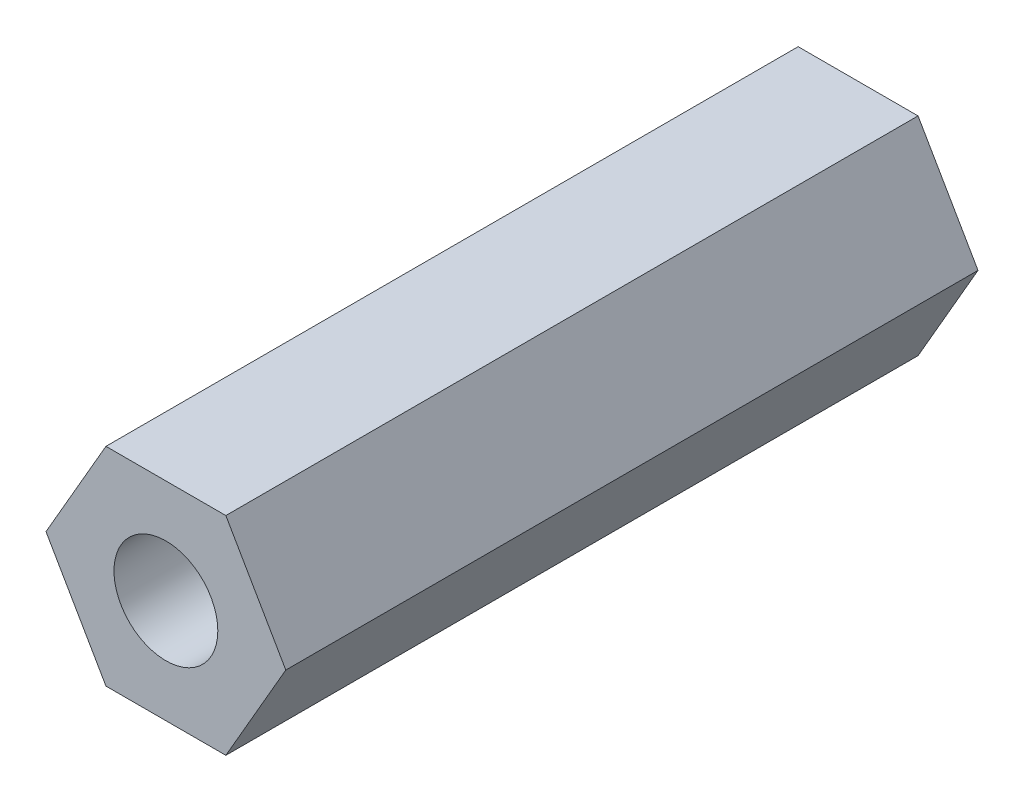
ISO-10303-21;
HEADER;
FILE_DESCRIPTION(('STEP AP214'),'2;1');
FILE_NAME('part.step','',(''),(''),'','','');
FILE_SCHEMA(('AUTOMOTIVE_DESIGN { 1 0 10303 214 1 1 1 1 }'));
ENDSEC;
DATA;
#1=APPLICATION_CONTEXT('core data for automotive mechanical design processes');
#2=APPLICATION_PROTOCOL_DEFINITION('international standard','automotive_design',2000,#1);
#3=PRODUCT_CONTEXT('',#1,'mechanical');
#4=PRODUCT('Part','Part','',(#3));
#5=PRODUCT_RELATED_PRODUCT_CATEGORY('part','',(#4));
#6=PRODUCT_DEFINITION_FORMATION('','',#4);
#7=PRODUCT_DEFINITION_CONTEXT('part definition',#1,'design');
#8=PRODUCT_DEFINITION('design','',#6,#7);
#9=PRODUCT_DEFINITION_SHAPE('','',#8);
#10=(LENGTH_UNIT() NAMED_UNIT(*) SI_UNIT(.MILLI.,.METRE.));
#11=(NAMED_UNIT(*) PLANE_ANGLE_UNIT() SI_UNIT($,.RADIAN.));
#12=(NAMED_UNIT(*) SI_UNIT($,.STERADIAN.) SOLID_ANGLE_UNIT());
#13=UNCERTAINTY_MEASURE_WITH_UNIT(LENGTH_MEASURE(1.E-05),#10,'distance_accuracy_value','');
#14=(GEOMETRIC_REPRESENTATION_CONTEXT(3) GLOBAL_UNCERTAINTY_ASSIGNED_CONTEXT((#13)) GLOBAL_UNIT_ASSIGNED_CONTEXT((#10,
#11,#12)) REPRESENTATION_CONTEXT('',''));
#15=CARTESIAN_POINT('',(0.,0.,0.));
#16=DIRECTION('',(0.,0.,1.));
#17=DIRECTION('',(1.,0.,0.));
#18=AXIS2_PLACEMENT_3D('',#15,#16,#17);
#19=CARTESIAN_POINT('',(0.,-3.,20.));
#20=DIRECTION('',(0.,1.,0.));
#21=DIRECTION('',(0.,0.,1.));
#22=AXIS2_PLACEMENT_3D('',#19,#20,#21);
#23=PLANE('',#22);
#24=DIRECTION('',(1.,0.,0.));
#25=VECTOR('',#24,1.);
#26=CARTESIAN_POINT('',(0.,-3.,0.));
#27=LINE('',#26,#25);
#28=CARTESIAN_POINT('',(-1.73205080756888,-3.,0.));
#29=VERTEX_POINT('',#28);
#30=CARTESIAN_POINT('',(1.73205080756888,-3.,0.));
#31=VERTEX_POINT('',#30);
#32=EDGE_CURVE('E129',#29,#31,#27,.T.);
#33=ORIENTED_EDGE('',*,*,#32,.T.);
#34=DIRECTION('',(0.,0.,-1.));
#35=VECTOR('',#34,1.);
#36=CARTESIAN_POINT('',(1.73205080756888,-3.,20.));
#37=LINE('',#36,#35);
#38=CARTESIAN_POINT('',(1.73205080756888,-3.,20.));
#39=VERTEX_POINT('',#38);
#40=EDGE_CURVE('E11',#39,#31,#37,.T.);
#41=ORIENTED_EDGE('',*,*,#40,.F.);
#42=DIRECTION('',(1.,0.,0.));
#43=VECTOR('',#42,1.);
#44=CARTESIAN_POINT('',(0.,-3.,20.));
#45=LINE('',#44,#43);
#46=CARTESIAN_POINT('',(-1.73205080756888,-3.,20.));
#47=VERTEX_POINT('',#46);
#48=EDGE_CURVE('E152',#47,#39,#45,.T.);
#49=ORIENTED_EDGE('',*,*,#48,.F.);
#50=DIRECTION('',(0.,0.,-1.));
#51=VECTOR('',#50,1.);
#52=CARTESIAN_POINT('',(-1.73205080756888,-3.,20.));
#53=LINE('',#52,#51);
#54=EDGE_CURVE('E122',#47,#29,#53,.T.);
#55=ORIENTED_EDGE('',*,*,#54,.T.);
#56=EDGE_LOOP('',(#33,#41,#49,#55));
#57=FACE_BOUND('',#56,.T.);
#58=ADVANCED_FACE('F41',(#57),#23,.F.);
#59=CARTESIAN_POINT('',(2.59807621135332,-1.5,20.));
#60=DIRECTION('',(-0.866025403784439,0.5,0.));
#61=DIRECTION('',(-0.5,-0.866025403784439,0.));
#62=AXIS2_PLACEMENT_3D('',#59,#60,#61);
#63=PLANE('',#62);
#64=DIRECTION('',(0.5,0.866025403784439,0.));
#65=VECTOR('',#64,1.);
#66=CARTESIAN_POINT('',(2.59807621135332,-1.5,0.));
#67=LINE('',#66,#65);
#68=CARTESIAN_POINT('',(3.46410161513776,0.,0.));
#69=VERTEX_POINT('',#68);
#70=EDGE_CURVE('E132',#31,#69,#67,.T.);
#71=ORIENTED_EDGE('',*,*,#70,.T.);
#72=DIRECTION('',(0.,0.,-1.));
#73=VECTOR('',#72,1.);
#74=CARTESIAN_POINT('',(3.46410161513776,0.,20.));
#75=LINE('',#74,#73);
#76=CARTESIAN_POINT('',(3.46410161513776,0.,20.));
#77=VERTEX_POINT('',#76);
#78=EDGE_CURVE('E50',#77,#69,#75,.T.);
#79=ORIENTED_EDGE('',*,*,#78,.F.);
#80=DIRECTION('',(0.5,0.866025403784439,0.));
#81=VECTOR('',#80,1.);
#82=CARTESIAN_POINT('',(2.59807621135332,-1.5,20.));
#83=LINE('',#82,#81);
#84=EDGE_CURVE('E95',#39,#77,#83,.T.);
#85=ORIENTED_EDGE('',*,*,#84,.F.);
#86=ORIENTED_EDGE('',*,*,#40,.T.);
#87=EDGE_LOOP('',(#71,#79,#85,#86));
#88=FACE_BOUND('',#87,.T.);
#89=ADVANCED_FACE('F166',(#88),#63,.F.);
#90=CARTESIAN_POINT('',(2.59807621135332,1.5,20.));
#91=DIRECTION('',(-0.866025403784439,-0.5,0.));
#92=DIRECTION('',(0.5,-0.866025403784439,0.));
#93=AXIS2_PLACEMENT_3D('',#90,#91,#92);
#94=PLANE('',#93);
#95=DIRECTION('',(-0.5,0.866025403784439,0.));
#96=VECTOR('',#95,1.);
#97=CARTESIAN_POINT('',(2.59807621135332,1.5,0.));
#98=LINE('',#97,#96);
#99=CARTESIAN_POINT('',(1.73205080756888,3.,0.));
#100=VERTEX_POINT('',#99);
#101=EDGE_CURVE('E134',#69,#100,#98,.T.);
#102=ORIENTED_EDGE('',*,*,#101,.T.);
#103=DIRECTION('',(0.,0.,-1.));
#104=VECTOR('',#103,1.);
#105=CARTESIAN_POINT('',(1.73205080756888,3.,20.));
#106=LINE('',#105,#104);
#107=CARTESIAN_POINT('',(1.73205080756888,3.,20.));
#108=VERTEX_POINT('',#107);
#109=EDGE_CURVE('E117',#108,#100,#106,.T.);
#110=ORIENTED_EDGE('',*,*,#109,.F.);
#111=DIRECTION('',(-0.5,0.866025403784439,0.));
#112=VECTOR('',#111,1.);
#113=CARTESIAN_POINT('',(2.59807621135332,1.5,20.));
#114=LINE('',#113,#112);
#115=EDGE_CURVE('E108',#77,#108,#114,.T.);
#116=ORIENTED_EDGE('',*,*,#115,.F.);
#117=ORIENTED_EDGE('',*,*,#78,.T.);
#118=EDGE_LOOP('',(#102,#110,#116,#117));
#119=FACE_BOUND('',#118,.T.);
#120=ADVANCED_FACE('F145',(#119),#94,.F.);
#121=CARTESIAN_POINT('',(0.,3.,20.));
#122=DIRECTION('',(0.,-1.,0.));
#123=DIRECTION('',(1.,0.,0.));
#124=AXIS2_PLACEMENT_3D('',#121,#122,#123);
#125=PLANE('',#124);
#126=DIRECTION('',(-1.,0.,0.));
#127=VECTOR('',#126,1.);
#128=CARTESIAN_POINT('',(0.,3.,0.));
#129=LINE('',#128,#127);
#130=CARTESIAN_POINT('',(-1.73205080756888,3.,0.));
#131=VERTEX_POINT('',#130);
#132=EDGE_CURVE('E116',#100,#131,#129,.T.);
#133=ORIENTED_EDGE('',*,*,#132,.T.);
#134=DIRECTION('',(0.,0.,-1.));
#135=VECTOR('',#134,1.);
#136=CARTESIAN_POINT('',(-1.73205080756888,3.,20.));
#137=LINE('',#136,#135);
#138=CARTESIAN_POINT('',(-1.73205080756888,3.,20.));
#139=VERTEX_POINT('',#138);
#140=EDGE_CURVE('E113',#139,#131,#137,.T.);
#141=ORIENTED_EDGE('',*,*,#140,.F.);
#142=DIRECTION('',(-1.,0.,0.));
#143=VECTOR('',#142,1.);
#144=CARTESIAN_POINT('',(0.,3.,20.));
#145=LINE('',#144,#143);
#146=EDGE_CURVE('E102',#108,#139,#145,.T.);
#147=ORIENTED_EDGE('',*,*,#146,.F.);
#148=ORIENTED_EDGE('',*,*,#109,.T.);
#149=EDGE_LOOP('',(#133,#141,#147,#148));
#150=FACE_BOUND('',#149,.T.);
#151=ADVANCED_FACE('F114',(#150),#125,.F.);
#152=CARTESIAN_POINT('',(-2.59807621135332,1.5,20.));
#153=DIRECTION('',(0.866025403784439,-0.5,0.));
#154=DIRECTION('',(0.5,0.866025403784439,0.));
#155=AXIS2_PLACEMENT_3D('',#152,#153,#154);
#156=PLANE('',#155);
#157=DIRECTION('',(-0.5,-0.866025403784439,0.));
#158=VECTOR('',#157,1.);
#159=CARTESIAN_POINT('',(-2.59807621135332,1.5,0.));
#160=LINE('',#159,#158);
#161=CARTESIAN_POINT('',(-3.46410161513776,0.,0.));
#162=VERTEX_POINT('',#161);
#163=EDGE_CURVE('E81',#131,#162,#160,.T.);
#164=ORIENTED_EDGE('',*,*,#163,.T.);
#165=DIRECTION('',(0.,0.,-1.));
#166=VECTOR('',#165,1.);
#167=CARTESIAN_POINT('',(-3.46410161513776,0.,20.));
#168=LINE('',#167,#166);
#169=CARTESIAN_POINT('',(-3.46410161513776,0.,20.));
#170=VERTEX_POINT('',#169);
#171=EDGE_CURVE('E118',#170,#162,#168,.T.);
#172=ORIENTED_EDGE('',*,*,#171,.F.);
#173=DIRECTION('',(-0.5,-0.866025403784439,0.));
#174=VECTOR('',#173,1.);
#175=CARTESIAN_POINT('',(-2.59807621135332,1.5,20.));
#176=LINE('',#175,#174);
#177=EDGE_CURVE('E106',#139,#170,#176,.T.);
#178=ORIENTED_EDGE('',*,*,#177,.F.);
#179=ORIENTED_EDGE('',*,*,#140,.T.);
#180=EDGE_LOOP('',(#164,#172,#178,#179));
#181=FACE_BOUND('',#180,.T.);
#182=ADVANCED_FACE('F120',(#181),#156,.F.);
#183=CARTESIAN_POINT('',(0.,0.,20.));
#184=DIRECTION('',(0.,0.,-1.));
#185=DIRECTION('',(-1.,0.,0.));
#186=AXIS2_PLACEMENT_3D('',#183,#184,#185);
#187=CYLINDRICAL_SURFACE('',#186,1.5);
#188=CARTESIAN_POINT('',(0.,0.,20.));
#189=DIRECTION('',(0.,0.,1.));
#190=DIRECTION('',(1.,0.,0.));
#191=AXIS2_PLACEMENT_3D('',#188,#189,#190);
#192=CIRCLE('',#191,1.5);
#193=CARTESIAN_POINT('',(1.5,0.,20.));
#194=VERTEX_POINT('',#193);
#195=EDGE_CURVE('E139',#194,#194,#192,.T.);
#196=ORIENTED_EDGE('',*,*,#195,.T.);
#197=EDGE_LOOP('',(#196));
#198=FACE_BOUND('',#197,.T.);
#199=CARTESIAN_POINT('',(0.,0.,0.));
#200=DIRECTION('',(0.,0.,1.));
#201=DIRECTION('',(1.,0.,0.));
#202=AXIS2_PLACEMENT_3D('',#199,#200,#201);
#203=CIRCLE('',#202,1.5);
#204=CARTESIAN_POINT('',(1.5,0.,0.));
#205=VERTEX_POINT('',#204);
#206=EDGE_CURVE('E126',#205,#205,#203,.T.);
#207=ORIENTED_EDGE('',*,*,#206,.F.);
#208=EDGE_LOOP('',(#207));
#209=FACE_BOUND('',#208,.T.);
#210=ADVANCED_FACE('F43',(#198,#209),#187,.F.);
#211=CARTESIAN_POINT('',(-2.59807621135332,-1.5,20.));
#212=DIRECTION('',(0.866025403784439,0.5,0.));
#213=DIRECTION('',(-0.5,0.866025403784439,0.));
#214=AXIS2_PLACEMENT_3D('',#211,#212,#213);
#215=PLANE('',#214);
#216=DIRECTION('',(0.5,-0.866025403784439,0.));
#217=VECTOR('',#216,1.);
#218=CARTESIAN_POINT('',(-2.59807621135332,-1.5,0.));
#219=LINE('',#218,#217);
#220=EDGE_CURVE('E87',#162,#29,#219,.T.);
#221=ORIENTED_EDGE('',*,*,#220,.T.);
#222=ORIENTED_EDGE('',*,*,#54,.F.);
#223=DIRECTION('',(0.5,-0.866025403784439,0.));
#224=VECTOR('',#223,1.);
#225=CARTESIAN_POINT('',(-2.59807621135332,-1.5,20.));
#226=LINE('',#225,#224);
#227=EDGE_CURVE('E58',#170,#47,#226,.T.);
#228=ORIENTED_EDGE('',*,*,#227,.F.);
#229=ORIENTED_EDGE('',*,*,#171,.T.);
#230=EDGE_LOOP('',(#221,#222,#228,#229));
#231=FACE_BOUND('',#230,.T.);
#232=ADVANCED_FACE('F153',(#231),#215,.F.);
#233=CARTESIAN_POINT('',(0.,0.,20.));
#234=DIRECTION('',(0.,0.,1.));
#235=DIRECTION('',(1.,0.,0.));
#236=AXIS2_PLACEMENT_3D('',#233,#234,#235);
#237=PLANE('',#236);
#238=ORIENTED_EDGE('',*,*,#195,.F.);
#239=EDGE_LOOP('',(#238));
#240=FACE_BOUND('',#239,.T.);
#241=ORIENTED_EDGE('',*,*,#48,.T.);
#242=ORIENTED_EDGE('',*,*,#84,.T.);
#243=ORIENTED_EDGE('',*,*,#115,.T.);
#244=ORIENTED_EDGE('',*,*,#146,.T.);
#245=ORIENTED_EDGE('',*,*,#177,.T.);
#246=ORIENTED_EDGE('',*,*,#227,.T.);
#247=EDGE_LOOP('',(#241,#242,#243,#244,#245,#246));
#248=FACE_BOUND('',#247,.T.);
#249=ADVANCED_FACE('F104',(#240,#248),#237,.T.);
#250=CARTESIAN_POINT('',(0.,0.,0.));
#251=DIRECTION('',(0.,0.,1.));
#252=DIRECTION('',(1.,0.,0.));
#253=AXIS2_PLACEMENT_3D('',#250,#251,#252);
#254=PLANE('',#253);
#255=ORIENTED_EDGE('',*,*,#206,.T.);
#256=EDGE_LOOP('',(#255));
#257=FACE_BOUND('',#256,.T.);
#258=ORIENTED_EDGE('',*,*,#32,.F.);
#259=ORIENTED_EDGE('',*,*,#220,.F.);
#260=ORIENTED_EDGE('',*,*,#163,.F.);
#261=ORIENTED_EDGE('',*,*,#132,.F.);
#262=ORIENTED_EDGE('',*,*,#101,.F.);
#263=ORIENTED_EDGE('',*,*,#70,.F.);
#264=EDGE_LOOP('',(#258,#259,#260,#261,#262,#263));
#265=FACE_BOUND('',#264,.T.);
#266=ADVANCED_FACE('F148',(#257,#265),#254,.F.);
#267=CLOSED_SHELL('',(#58,#89,#120,#151,#182,#210,#232,#249,#266));
#268=MANIFOLD_SOLID_BREP('B2',#267);
#269=ADVANCED_BREP_SHAPE_REPRESENTATION('',(#18,#268),#14);
#270=SHAPE_DEFINITION_REPRESENTATION(#9,#269);
ENDSEC;
END-ISO-10303-21;
